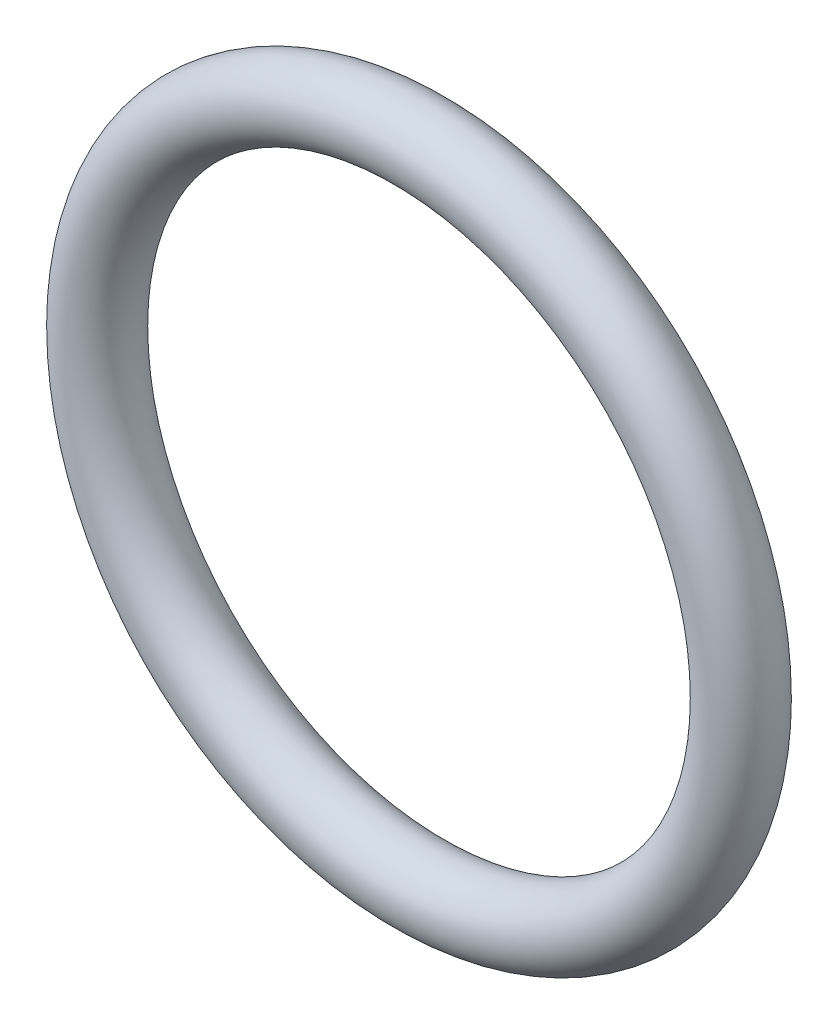
ISO-10303-21;
HEADER;
FILE_DESCRIPTION(('STEP AP214'),'2;1');
FILE_NAME('part.step','',(''),(''),'','','');
FILE_SCHEMA(('AUTOMOTIVE_DESIGN { 1 0 10303 214 1 1 1 1 }'));
ENDSEC;
DATA;
#1=APPLICATION_CONTEXT('core data for automotive mechanical design processes');
#2=APPLICATION_PROTOCOL_DEFINITION('international standard','automotive_design',2000,#1);
#3=PRODUCT_CONTEXT('',#1,'mechanical');
#4=PRODUCT('Part','Part','',(#3));
#5=PRODUCT_RELATED_PRODUCT_CATEGORY('part','',(#4));
#6=PRODUCT_DEFINITION_FORMATION('','',#4);
#7=PRODUCT_DEFINITION_CONTEXT('part definition',#1,'design');
#8=PRODUCT_DEFINITION('design','',#6,#7);
#9=PRODUCT_DEFINITION_SHAPE('','',#8);
#10=(LENGTH_UNIT() NAMED_UNIT(*) SI_UNIT(.MILLI.,.METRE.));
#11=(NAMED_UNIT(*) PLANE_ANGLE_UNIT() SI_UNIT($,.RADIAN.));
#12=(NAMED_UNIT(*) SI_UNIT($,.STERADIAN.) SOLID_ANGLE_UNIT());
#13=UNCERTAINTY_MEASURE_WITH_UNIT(LENGTH_MEASURE(1.E-05),#10,'distance_accuracy_value','');
#14=(GEOMETRIC_REPRESENTATION_CONTEXT(3) GLOBAL_UNCERTAINTY_ASSIGNED_CONTEXT((#13)) GLOBAL_UNIT_ASSIGNED_CONTEXT((#10,
#11,#12)) REPRESENTATION_CONTEXT('',''));
#15=CARTESIAN_POINT('',(0.,0.,0.));
#16=DIRECTION('',(0.,0.,1.));
#17=DIRECTION('',(1.,0.,0.));
#18=AXIS2_PLACEMENT_3D('',#15,#16,#17);
#19=CARTESIAN_POINT('',(0.,0.,0.));
#20=DIRECTION('',(0.,0.,-1.));
#21=DIRECTION('',(-1.,0.,0.));
#22=AXIS2_PLACEMENT_3D('',#19,#20,#21);
#23=TOROIDAL_SURFACE('',#22,6.75,0.749999999999999);
#24=CARTESIAN_POINT('',(-7.5,0.,0.));
#25=VERTEX_POINT('',#24);
#26=VERTEX_LOOP('',#25);
#27=FACE_BOUND('',#26,.T.);
#28=ADVANCED_FACE('F35',(#27),#23,.T.);
#29=CLOSED_SHELL('',(#28));
#30=MANIFOLD_SOLID_BREP('B2',#29);
#31=ADVANCED_BREP_SHAPE_REPRESENTATION('',(#18,#30),#14);
#32=SHAPE_DEFINITION_REPRESENTATION(#9,#31);
ENDSEC;
END-ISO-10303-21;
